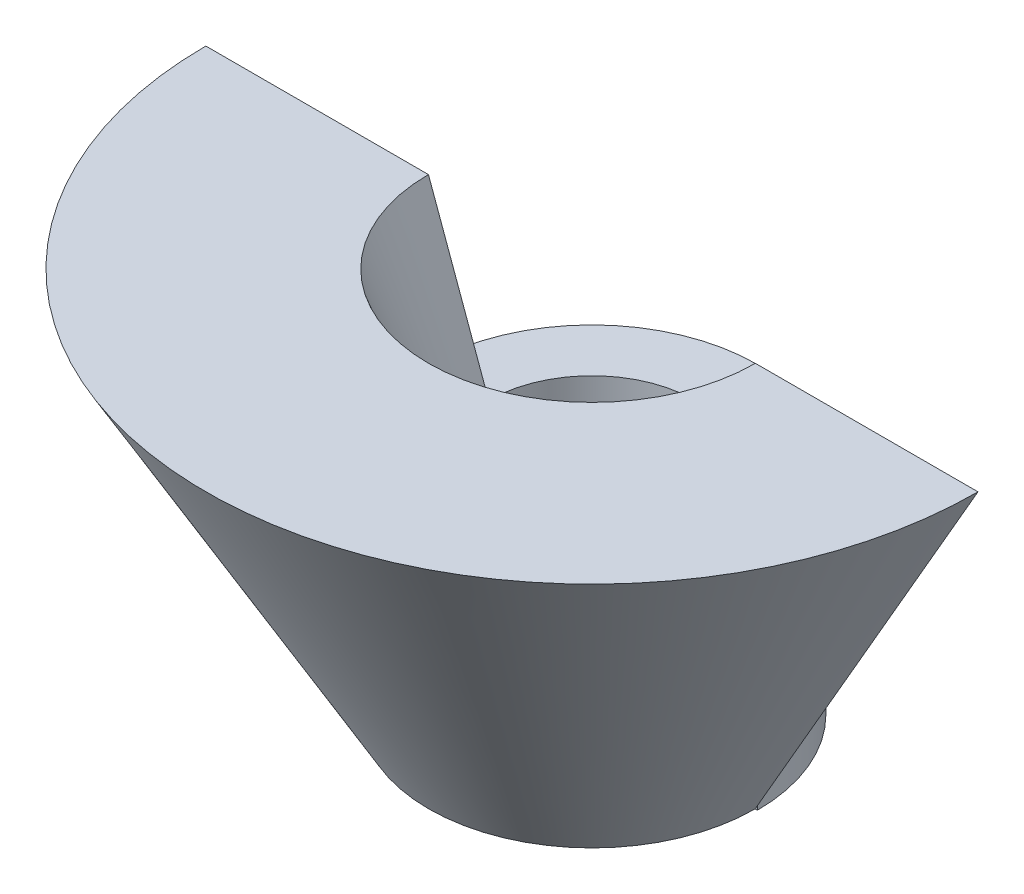
ISO-10303-21;
HEADER;
FILE_DESCRIPTION(('STEP AP214'),'2;1');
FILE_NAME('part.step','',(''),(''),'','','');
FILE_SCHEMA(('AUTOMOTIVE_DESIGN { 1 0 10303 214 1 1 1 1 }'));
ENDSEC;
DATA;
#1=APPLICATION_CONTEXT('core data for automotive mechanical design processes');
#2=APPLICATION_PROTOCOL_DEFINITION('international standard','automotive_design',2000,#1);
#3=PRODUCT_CONTEXT('',#1,'mechanical');
#4=PRODUCT('Part','Part','',(#3));
#5=PRODUCT_RELATED_PRODUCT_CATEGORY('part','',(#4));
#6=PRODUCT_DEFINITION_FORMATION('','',#4);
#7=PRODUCT_DEFINITION_CONTEXT('part definition',#1,'design');
#8=PRODUCT_DEFINITION('design','',#6,#7);
#9=PRODUCT_DEFINITION_SHAPE('','',#8);
#10=(LENGTH_UNIT() NAMED_UNIT(*) SI_UNIT(.MILLI.,.METRE.));
#11=(NAMED_UNIT(*) PLANE_ANGLE_UNIT() SI_UNIT($,.RADIAN.));
#12=(NAMED_UNIT(*) SI_UNIT($,.STERADIAN.) SOLID_ANGLE_UNIT());
#13=UNCERTAINTY_MEASURE_WITH_UNIT(LENGTH_MEASURE(1.E-05),#10,'distance_accuracy_value','');
#14=(GEOMETRIC_REPRESENTATION_CONTEXT(3) GLOBAL_UNCERTAINTY_ASSIGNED_CONTEXT((#13)) GLOBAL_UNIT_ASSIGNED_CONTEXT((#10,
#11,#12)) REPRESENTATION_CONTEXT('',''));
#15=CARTESIAN_POINT('',(0.,0.,0.));
#16=DIRECTION('',(0.,0.,1.));
#17=DIRECTION('',(1.,0.,0.));
#18=AXIS2_PLACEMENT_3D('',#15,#16,#17);
#19=CARTESIAN_POINT('',(-2.9718,6.35,0.));
#20=DIRECTION('',(0.,1.,0.));
#21=DIRECTION('',(0.,0.,1.));
#22=AXIS2_PLACEMENT_3D('',#19,#20,#21);
#23=PLANE('',#22);
#24=DIRECTION('',(-1.,0.,0.));
#25=VECTOR('',#24,1.);
#26=CARTESIAN_POINT('',(0.,6.35,0.));
#27=LINE('',#26,#25);
#28=CARTESIAN_POINT('',(4.7625,6.35,0.));
#29=VERTEX_POINT('',#28);
#30=CARTESIAN_POINT('',(2.9718,6.35,0.));
#31=VERTEX_POINT('',#30);
#32=EDGE_CURVE('E11',#29,#31,#27,.T.);
#33=ORIENTED_EDGE('',*,*,#32,.F.);
#34=CARTESIAN_POINT('',(0.,6.35,0.));
#35=DIRECTION('',(0.,1.,0.));
#36=DIRECTION('',(0.,0.,1.));
#37=AXIS2_PLACEMENT_3D('',#34,#35,#36);
#38=CIRCLE('',#37,4.7625);
#39=CARTESIAN_POINT('',(-4.7625,6.35,0.));
#40=VERTEX_POINT('',#39);
#41=EDGE_CURVE('E145',#29,#40,#38,.T.);
#42=ORIENTED_EDGE('',*,*,#41,.T.);
#43=DIRECTION('',(-1.,0.,0.));
#44=VECTOR('',#43,1.);
#45=CARTESIAN_POINT('',(0.,6.35,0.));
#46=LINE('',#45,#44);
#47=CARTESIAN_POINT('',(-2.9718,6.35,0.));
#48=VERTEX_POINT('',#47);
#49=EDGE_CURVE('E137',#48,#40,#46,.T.);
#50=ORIENTED_EDGE('',*,*,#49,.F.);
#51=CARTESIAN_POINT('',(0.,6.35,0.));
#52=DIRECTION('',(0.,1.,0.));
#53=DIRECTION('',(0.,0.,1.));
#54=AXIS2_PLACEMENT_3D('',#51,#52,#53);
#55=CIRCLE('',#54,2.9718);
#56=EDGE_CURVE('E166',#31,#48,#55,.T.);
#57=ORIENTED_EDGE('',*,*,#56,.F.);
#58=EDGE_LOOP('',(#33,#42,#50,#57));
#59=FACE_BOUND('',#58,.T.);
#60=ADVANCED_FACE('F40',(#59),#23,.T.);
#61=CARTESIAN_POINT('',(11.1125,-24.8483053999664,0.));
#62=DIRECTION('',(0.,0.,-1.));
#63=DIRECTION('',(-1.,0.,0.));
#64=AXIS2_PLACEMENT_3D('',#61,#62,#63);
#65=PLANE('',#64);
#66=DIRECTION('',(0.,-1.,0.));
#67=VECTOR('',#66,1.);
#68=CARTESIAN_POINT('',(4.7625,6.35,0.));
#69=LINE('',#68,#67);
#70=CARTESIAN_POINT('',(4.7625,0.113977371937659,0.));
#71=VERTEX_POINT('',#70);
#72=CARTESIAN_POINT('',(4.7625,0.,0.));
#73=VERTEX_POINT('',#72);
#74=EDGE_CURVE('E81',#71,#73,#69,.T.);
#75=ORIENTED_EDGE('',*,*,#74,.F.);
#76=DIRECTION('',(-0.500000000000001,-0.866025403784438,0.));
#77=VECTOR('',#76,1.);
#78=CARTESIAN_POINT('',(0.,-8.13491459910909,0.));
#79=LINE('',#78,#77);
#80=CARTESIAN_POINT('',(4.69669513363027,0.,0.));
#81=VERTEX_POINT('',#80);
#82=EDGE_CURVE('E51',#81,#71,#79,.F.);
#83=ORIENTED_EDGE('',*,*,#82,.F.);
#84=DIRECTION('',(1.,0.,0.));
#85=VECTOR('',#84,1.);
#86=CARTESIAN_POINT('',(11.1125,0.,0.));
#87=LINE('',#86,#85);
#88=EDGE_CURVE('E152',#73,#81,#87,.F.);
#89=ORIENTED_EDGE('',*,*,#88,.F.);
#90=EDGE_LOOP('',(#75,#83,#89));
#91=FACE_BOUND('',#90,.T.);
#92=ADVANCED_FACE('F200',(#91),#65,.F.);
#93=CARTESIAN_POINT('',(0.,0.,0.));
#94=DIRECTION('',(0.,1.,0.));
#95=DIRECTION('',(0.,0.,1.));
#96=AXIS2_PLACEMENT_3D('',#93,#94,#95);
#97=PLANE('',#96);
#98=DIRECTION('',(1.,0.,0.));
#99=VECTOR('',#98,1.);
#100=CARTESIAN_POINT('',(-11.1125,0.,0.));
#101=LINE('',#100,#99);
#102=CARTESIAN_POINT('',(-4.69669513363027,0.,0.));
#103=VERTEX_POINT('',#102);
#104=CARTESIAN_POINT('',(-4.7625,0.,0.));
#105=VERTEX_POINT('',#104);
#106=EDGE_CURVE('E157',#103,#105,#101,.F.);
#107=ORIENTED_EDGE('',*,*,#106,.T.);
#108=CARTESIAN_POINT('',(0.,0.,0.));
#109=DIRECTION('',(0.,1.,0.));
#110=DIRECTION('',(0.,0.,1.));
#111=AXIS2_PLACEMENT_3D('',#108,#109,#110);
#112=CIRCLE('',#111,4.7625);
#113=EDGE_CURVE('E163',#73,#105,#112,.T.);
#114=ORIENTED_EDGE('',*,*,#113,.F.);
#115=ORIENTED_EDGE('',*,*,#88,.T.);
#116=CARTESIAN_POINT('',(0.,0.,0.));
#117=DIRECTION('',(0.,1.,0.));
#118=DIRECTION('',(0.,0.,1.));
#119=AXIS2_PLACEMENT_3D('',#116,#117,#118);
#120=CIRCLE('',#119,4.69669513363027);
#121=EDGE_CURVE('E155',#81,#103,#120,.F.);
#122=ORIENTED_EDGE('',*,*,#121,.T.);
#123=EDGE_LOOP('',(#107,#114,#115,#122));
#124=FACE_BOUND('',#123,.T.);
#125=CARTESIAN_POINT('',(0.,0.,0.));
#126=DIRECTION('',(0.,1.,0.));
#127=DIRECTION('',(0.,0.,1.));
#128=AXIS2_PLACEMENT_3D('',#125,#126,#127);
#129=CIRCLE('',#128,2.9718);
#130=CARTESIAN_POINT('',(0.,0.,2.9718));
#131=VERTEX_POINT('',#130);
#132=EDGE_CURVE('E170',#131,#131,#129,.T.);
#133=ORIENTED_EDGE('',*,*,#132,.T.);
#134=EDGE_LOOP('',(#133));
#135=FACE_BOUND('',#134,.T.);
#136=ADVANCED_FACE('F205',(#124,#135),#97,.F.);
#137=CARTESIAN_POINT('',(-11.1125,-24.8483053999664,0.));
#138=DIRECTION('',(0.,0.,-1.));
#139=DIRECTION('',(-1.,0.,0.));
#140=AXIS2_PLACEMENT_3D('',#137,#138,#139);
#141=PLANE('',#140);
#142=DIRECTION('',(-0.500000000000001,0.866025403784438,0.));
#143=VECTOR('',#142,1.);
#144=CARTESIAN_POINT('',(0.,-8.13491459910909,0.));
#145=LINE('',#144,#143);
#146=CARTESIAN_POINT('',(-4.7625,0.113977371937659,0.));
#147=VERTEX_POINT('',#146);
#148=EDGE_CURVE('E77',#103,#147,#145,.T.);
#149=ORIENTED_EDGE('',*,*,#148,.T.);
#150=DIRECTION('',(0.,-1.,0.));
#151=VECTOR('',#150,1.);
#152=CARTESIAN_POINT('',(-4.7625,6.35,0.));
#153=LINE('',#152,#151);
#154=EDGE_CURVE('E72',#105,#147,#153,.F.);
#155=ORIENTED_EDGE('',*,*,#154,.F.);
#156=ORIENTED_EDGE('',*,*,#106,.F.);
#157=EDGE_LOOP('',(#149,#155,#156));
#158=FACE_BOUND('',#157,.T.);
#159=ADVANCED_FACE('F217',(#158),#141,.F.);
#160=CARTESIAN_POINT('',(0.,11.1125,0.));
#161=DIRECTION('',(0.,1.,0.));
#162=DIRECTION('',(0.,0.,1.));
#163=AXIS2_PLACEMENT_3D('',#160,#161,#162);
#164=CONICAL_SURFACE('',#163,11.1125,0.5235987755983);
#165=CARTESIAN_POINT('',(11.1125,11.1125,0.));
#166=VERTEX_POINT('',#165);
#167=EDGE_CURVE('E44',#71,#166,#79,.F.);
#168=ORIENTED_EDGE('',*,*,#167,.T.);
#169=CARTESIAN_POINT('',(0.,11.1125,0.));
#170=DIRECTION('',(0.,1.,0.));
#171=DIRECTION('',(0.,0.,1.));
#172=AXIS2_PLACEMENT_3D('',#169,#170,#171);
#173=CIRCLE('',#172,11.1125);
#174=CARTESIAN_POINT('',(-11.1125,11.1125,0.));
#175=VERTEX_POINT('',#174);
#176=EDGE_CURVE('E111',#175,#166,#173,.T.);
#177=ORIENTED_EDGE('',*,*,#176,.F.);
#178=EDGE_CURVE('E116',#147,#175,#145,.T.);
#179=ORIENTED_EDGE('',*,*,#178,.F.);
#180=ORIENTED_EDGE('',*,*,#148,.F.);
#181=ORIENTED_EDGE('',*,*,#121,.F.);
#182=ORIENTED_EDGE('',*,*,#82,.T.);
#183=EDGE_LOOP('',(#168,#177,#179,#180,#181,#182));
#184=FACE_BOUND('',#183,.T.);
#185=ADVANCED_FACE('F109',(#184),#164,.T.);
#186=CARTESIAN_POINT('',(0.,6.35,0.));
#187=DIRECTION('',(0.,-1.,0.));
#188=DIRECTION('',(0.,0.,-1.));
#189=AXIS2_PLACEMENT_3D('',#186,#187,#188);
#190=CYLINDRICAL_SURFACE('',#189,4.7625);
#191=ORIENTED_EDGE('',*,*,#113,.T.);
#192=ORIENTED_EDGE('',*,*,#154,.T.);
#193=EDGE_CURVE('E174',#147,#40,#153,.F.);
#194=ORIENTED_EDGE('',*,*,#193,.T.);
#195=ORIENTED_EDGE('',*,*,#41,.F.);
#196=EDGE_CURVE('E156',#29,#71,#69,.T.);
#197=ORIENTED_EDGE('',*,*,#196,.T.);
#198=ORIENTED_EDGE('',*,*,#74,.T.);
#199=EDGE_LOOP('',(#191,#192,#194,#195,#197,#198));
#200=FACE_BOUND('',#199,.T.);
#201=ADVANCED_FACE('F188',(#200),#190,.T.);
#202=ORIENTED_EDGE('',*,*,#196,.F.);
#203=ORIENTED_EDGE('',*,*,#32,.T.);
#204=DIRECTION('',(-0.342020143325669,-0.939692620785908,0.));
#205=VECTOR('',#204,1.);
#206=CARTESIAN_POINT('',(0.,-1.81495339513523,0.));
#207=LINE('',#206,#205);
#208=CARTESIAN_POINT('',(4.70520824069279,11.1125,0.));
#209=VERTEX_POINT('',#208);
#210=EDGE_CURVE('E121',#31,#209,#207,.F.);
#211=ORIENTED_EDGE('',*,*,#210,.T.);
#212=DIRECTION('',(-1.,0.,0.));
#213=VECTOR('',#212,1.);
#214=CARTESIAN_POINT('',(11.1125,11.1125,0.));
#215=LINE('',#214,#213);
#216=EDGE_CURVE('E118',#166,#209,#215,.T.);
#217=ORIENTED_EDGE('',*,*,#216,.F.);
#218=ORIENTED_EDGE('',*,*,#167,.F.);
#219=EDGE_LOOP('',(#202,#203,#211,#217,#218));
#220=FACE_BOUND('',#219,.T.);
#221=ADVANCED_FACE('F119',(#220),#65,.T.);
#222=ORIENTED_EDGE('',*,*,#178,.T.);
#223=DIRECTION('',(-1.,0.,0.));
#224=VECTOR('',#223,1.);
#225=CARTESIAN_POINT('',(-11.1125,11.1125,0.));
#226=LINE('',#225,#224);
#227=CARTESIAN_POINT('',(-4.70520824069279,11.1125,0.));
#228=VERTEX_POINT('',#227);
#229=EDGE_CURVE('E131',#228,#175,#226,.T.);
#230=ORIENTED_EDGE('',*,*,#229,.F.);
#231=DIRECTION('',(-0.342020143325669,0.939692620785908,0.));
#232=VECTOR('',#231,1.);
#233=CARTESIAN_POINT('',(0.,-1.81495339513523,0.));
#234=LINE('',#233,#232);
#235=EDGE_CURVE('E141',#48,#228,#234,.T.);
#236=ORIENTED_EDGE('',*,*,#235,.F.);
#237=ORIENTED_EDGE('',*,*,#49,.T.);
#238=ORIENTED_EDGE('',*,*,#193,.F.);
#239=EDGE_LOOP('',(#222,#230,#236,#237,#238));
#240=FACE_BOUND('',#239,.T.);
#241=ADVANCED_FACE('F42',(#240),#141,.T.);
#242=CARTESIAN_POINT('',(0.,6.35,0.));
#243=DIRECTION('',(0.,-1.,0.));
#244=DIRECTION('',(0.,0.,-1.));
#245=AXIS2_PLACEMENT_3D('',#242,#243,#244);
#246=CYLINDRICAL_SURFACE('',#245,2.9718);
#247=ORIENTED_EDGE('',*,*,#132,.F.);
#248=EDGE_LOOP('',(#247));
#249=FACE_BOUND('',#248,.T.);
#250=ORIENTED_EDGE('',*,*,#56,.T.);
#251=CARTESIAN_POINT('',(0.,6.35,0.));
#252=DIRECTION('',(0.,1.,0.));
#253=DIRECTION('',(0.,0.,1.));
#254=AXIS2_PLACEMENT_3D('',#251,#252,#253);
#255=CIRCLE('',#254,2.9718);
#256=EDGE_CURVE('E140',#48,#31,#255,.T.);
#257=ORIENTED_EDGE('',*,*,#256,.T.);
#258=EDGE_LOOP('',(#250,#257));
#259=FACE_BOUND('',#258,.T.);
#260=ADVANCED_FACE('F197',(#249,#259),#246,.F.);
#261=CARTESIAN_POINT('',(0.,11.1125,0.));
#262=DIRECTION('',(0.,1.,0.));
#263=DIRECTION('',(0.,0.,1.));
#264=AXIS2_PLACEMENT_3D('',#261,#262,#263);
#265=PLANE('',#264);
#266=ORIENTED_EDGE('',*,*,#176,.T.);
#267=ORIENTED_EDGE('',*,*,#216,.T.);
#268=CARTESIAN_POINT('',(0.,11.1125,0.));
#269=DIRECTION('',(0.,1.,0.));
#270=DIRECTION('',(0.,0.,1.));
#271=AXIS2_PLACEMENT_3D('',#268,#269,#270);
#272=CIRCLE('',#271,4.70520824069279);
#273=EDGE_CURVE('E126',#209,#228,#272,.F.);
#274=ORIENTED_EDGE('',*,*,#273,.T.);
#275=ORIENTED_EDGE('',*,*,#229,.T.);
#276=EDGE_LOOP('',(#266,#267,#274,#275));
#277=FACE_BOUND('',#276,.T.);
#278=ADVANCED_FACE('F129',(#277),#265,.T.);
#279=CARTESIAN_POINT('',(0.,6.35,0.));
#280=DIRECTION('',(0.,1.,0.));
#281=DIRECTION('',(0.,0.,1.));
#282=AXIS2_PLACEMENT_3D('',#279,#280,#281);
#283=CONICAL_SURFACE('',#282,2.9718,0.349065850398867);
#284=ORIENTED_EDGE('',*,*,#256,.F.);
#285=ORIENTED_EDGE('',*,*,#235,.T.);
#286=ORIENTED_EDGE('',*,*,#273,.F.);
#287=ORIENTED_EDGE('',*,*,#210,.F.);
#288=EDGE_LOOP('',(#284,#285,#286,#287));
#289=FACE_BOUND('',#288,.T.);
#290=ADVANCED_FACE('F195',(#289),#283,.F.);
#291=CLOSED_SHELL('',(#60,#92,#136,#159,#185,#201,#221,#241,#260,#278,#290));
#292=MANIFOLD_SOLID_BREP('B2',#291);
#293=ADVANCED_BREP_SHAPE_REPRESENTATION('',(#18,#292),#14);
#294=SHAPE_DEFINITION_REPRESENTATION(#9,#293);
ENDSEC;
END-ISO-10303-21;
